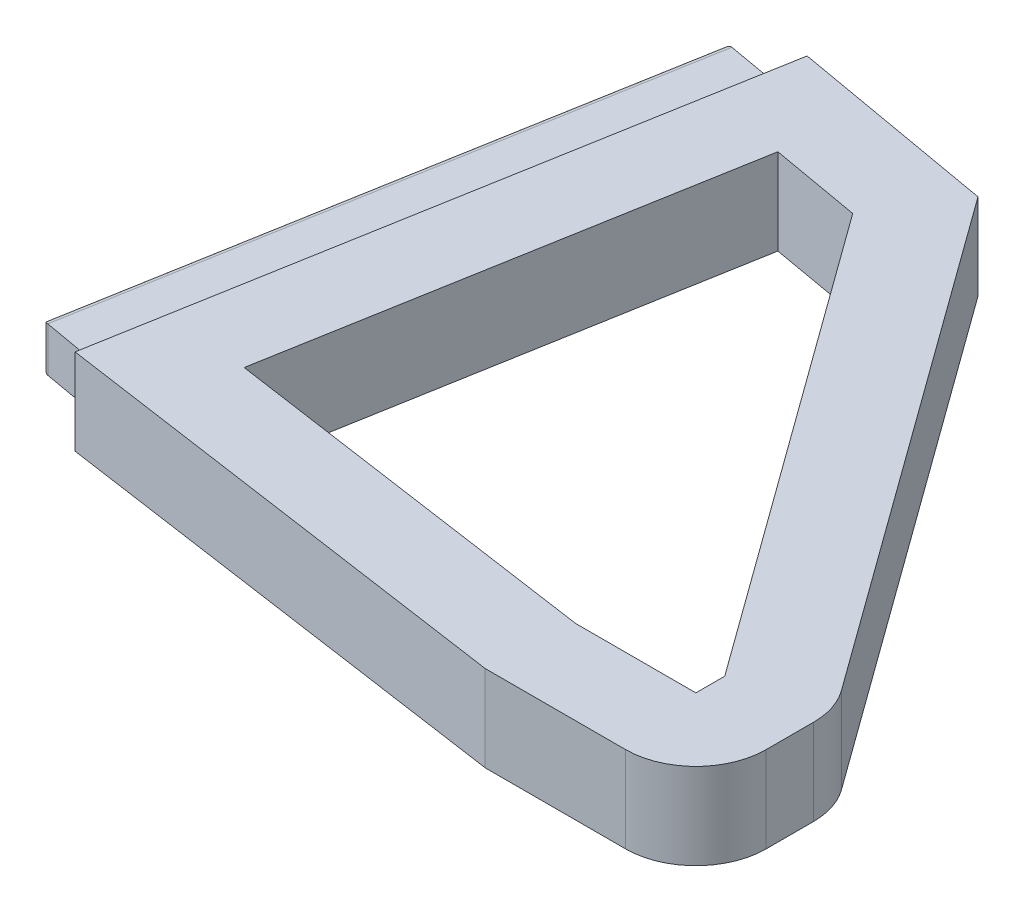
ISO-10303-21;
HEADER;
FILE_DESCRIPTION(('STEP AP214'),'2;1');
FILE_NAME('part.step','',(''),(''),'','','');
FILE_SCHEMA(('AUTOMOTIVE_DESIGN { 1 0 10303 214 1 1 1 1 }'));
ENDSEC;
DATA;
#1=APPLICATION_CONTEXT('core data for automotive mechanical design processes');
#2=APPLICATION_PROTOCOL_DEFINITION('international standard','automotive_design',2000,#1);
#3=PRODUCT_CONTEXT('',#1,'mechanical');
#4=PRODUCT('Part','Part','',(#3));
#5=PRODUCT_RELATED_PRODUCT_CATEGORY('part','',(#4));
#6=PRODUCT_DEFINITION_FORMATION('','',#4);
#7=PRODUCT_DEFINITION_CONTEXT('part definition',#1,'design');
#8=PRODUCT_DEFINITION('design','',#6,#7);
#9=PRODUCT_DEFINITION_SHAPE('','',#8);
#10=(LENGTH_UNIT() NAMED_UNIT(*) SI_UNIT(.MILLI.,.METRE.));
#11=(NAMED_UNIT(*) PLANE_ANGLE_UNIT() SI_UNIT($,.RADIAN.));
#12=(NAMED_UNIT(*) SI_UNIT($,.STERADIAN.) SOLID_ANGLE_UNIT());
#13=UNCERTAINTY_MEASURE_WITH_UNIT(LENGTH_MEASURE(1.E-05),#10,'distance_accuracy_value','');
#14=(GEOMETRIC_REPRESENTATION_CONTEXT(3) GLOBAL_UNCERTAINTY_ASSIGNED_CONTEXT((#13)) GLOBAL_UNIT_ASSIGNED_CONTEXT((#10,
#11,#12)) REPRESENTATION_CONTEXT('',''));
#15=CARTESIAN_POINT('',(0.,0.,0.));
#16=DIRECTION('',(0.,0.,1.));
#17=DIRECTION('',(1.,0.,0.));
#18=AXIS2_PLACEMENT_3D('',#15,#16,#17);
#19=CARTESIAN_POINT('',(17.3648177666923,12.25,-98.4807753012209));
#20=DIRECTION('',(0.984807753012209,0.,0.173648177666923));
#21=DIRECTION('',(0.173648177666923,0.,-0.984807753012209));
#22=AXIS2_PLACEMENT_3D('',#19,#20,#21);
#23=PLANE('',#22);
#24=DIRECTION('',(-0.173648177666923,0.,0.984807753012209));
#25=VECTOR('',#24,1.);
#26=CARTESIAN_POINT('',(17.3648177666923,0.,-98.4807753012209));
#27=LINE('',#26,#25);
#28=CARTESIAN_POINT('',(17.3648177666923,0.,-98.4807753012209));
#29=VERTEX_POINT('',#28);
#30=CARTESIAN_POINT('',(1.73648177666923,0.,-9.84807753012209));
#31=VERTEX_POINT('',#30);
#32=EDGE_CURVE('E313',#29,#31,#27,.T.);
#33=ORIENTED_EDGE('',*,*,#32,.T.);
#34=DIRECTION('',(0.,-1.,0.));
#35=VECTOR('',#34,1.);
#36=CARTESIAN_POINT('',(1.73648177666923,12.25,-9.84807753012209));
#37=LINE('',#36,#35);
#38=CARTESIAN_POINT('',(1.73648177666923,12.25,-9.84807753012209));
#39=VERTEX_POINT('',#38);
#40=EDGE_CURVE('E390',#39,#31,#37,.T.);
#41=ORIENTED_EDGE('',*,*,#40,.F.);
#42=DIRECTION('',(-0.173648177666923,0.,0.984807753012209));
#43=VECTOR('',#42,1.);
#44=CARTESIAN_POINT('',(17.3648177666923,12.25,-98.4807753012209));
#45=LINE('',#44,#43);
#46=CARTESIAN_POINT('',(17.3648177666923,12.25,-98.4807753012209));
#47=VERTEX_POINT('',#46);
#48=EDGE_CURVE('E314',#47,#39,#45,.T.);
#49=ORIENTED_EDGE('',*,*,#48,.F.);
#50=DIRECTION('',(0.,-1.,0.));
#51=VECTOR('',#50,1.);
#52=CARTESIAN_POINT('',(17.3648177666923,12.25,-98.4807753012209));
#53=LINE('',#52,#51);
#54=EDGE_CURVE('E339',#47,#29,#53,.T.);
#55=ORIENTED_EDGE('',*,*,#54,.T.);
#56=EDGE_LOOP('',(#33,#41,#49,#55));
#57=FACE_BOUND('',#56,.T.);
#58=DIRECTION('',(-0.173648177666923,0.,0.984807753012209));
#59=VECTOR('',#58,1.);
#60=CARTESIAN_POINT('',(16.8525556425749,2.95,-95.5755924298349));
#61=LINE('',#60,#59);
#62=CARTESIAN_POINT('',(16.8525556425749,2.95,-95.5755924298349));
#63=VERTEX_POINT('',#62);
#64=CARTESIAN_POINT('',(2.24874390078665,2.95,-12.7532604015081));
#65=VERTEX_POINT('',#64);
#66=EDGE_CURVE('E218',#63,#65,#61,.T.);
#67=ORIENTED_EDGE('',*,*,#66,.F.);
#68=DIRECTION('',(0.,-1.,0.));
#69=VECTOR('',#68,1.);
#70=CARTESIAN_POINT('',(16.8525556425749,9.3,-95.5755924298349));
#71=LINE('',#70,#69);
#72=CARTESIAN_POINT('',(16.8525556425749,9.3,-95.5755924298349));
#73=VERTEX_POINT('',#72);
#74=EDGE_CURVE('E222',#73,#63,#71,.T.);
#75=ORIENTED_EDGE('',*,*,#74,.F.);
#76=DIRECTION('',(0.173648177666923,0.,-0.984807753012209));
#77=VECTOR('',#76,1.);
#78=CARTESIAN_POINT('',(2.24874390078666,9.3,-12.7532604015081));
#79=LINE('',#78,#77);
#80=CARTESIAN_POINT('',(2.24874390078665,9.3,-12.7532604015081));
#81=VERTEX_POINT('',#80);
#82=EDGE_CURVE('E235',#81,#73,#79,.T.);
#83=ORIENTED_EDGE('',*,*,#82,.F.);
#84=DIRECTION('',(0.,1.,0.));
#85=VECTOR('',#84,1.);
#86=CARTESIAN_POINT('',(2.24874390078666,2.95,-12.7532604015081));
#87=LINE('',#86,#85);
#88=EDGE_CURVE('E230',#65,#81,#87,.T.);
#89=ORIENTED_EDGE('',*,*,#88,.F.);
#90=EDGE_LOOP('',(#67,#75,#83,#89));
#91=FACE_BOUND('',#90,.T.);
#92=ADVANCED_FACE('F39',(#57,#91),#23,.F.);
#93=CARTESIAN_POINT('',(90.,12.25,-10.));
#94=DIRECTION('',(0.,-1.,0.));
#95=DIRECTION('',(0.,0.,-1.));
#96=AXIS2_PLACEMENT_3D('',#93,#94,#95);
#97=PLANE('',#96);
#98=ORIENTED_EDGE('',*,*,#48,.T.);
#99=DIRECTION('',(0.989753387242238,0.,0.142787367937493));
#100=VECTOR('',#99,1.);
#101=CARTESIAN_POINT('',(70.,12.25,0.));
#102=LINE('',#101,#100);
#103=CARTESIAN_POINT('',(70.,12.25,0.));
#104=VERTEX_POINT('',#103);
#105=EDGE_CURVE('E317',#39,#104,#102,.T.);
#106=ORIENTED_EDGE('',*,*,#105,.T.);
#107=DIRECTION('',(1.,0.,0.));
#108=VECTOR('',#107,1.);
#109=CARTESIAN_POINT('',(89.9999999999999,12.25,0.));
#110=LINE('',#109,#108);
#111=CARTESIAN_POINT('',(89.9999999999999,12.25,0.));
#112=VERTEX_POINT('',#111);
#113=EDGE_CURVE('E321',#104,#112,#110,.T.);
#114=ORIENTED_EDGE('',*,*,#113,.T.);
#115=CARTESIAN_POINT('',(90.,12.25,-10.));
#116=DIRECTION('',(0.,1.,0.));
#117=DIRECTION('',(0.,0.,-1.));
#118=AXIS2_PLACEMENT_3D('',#115,#116,#117);
#119=CIRCLE('',#118,10.);
#120=CARTESIAN_POINT('',(100.,12.25,-10.0000000000001));
#121=VERTEX_POINT('',#120);
#122=EDGE_CURVE('E324',#112,#121,#119,.T.);
#123=ORIENTED_EDGE('',*,*,#122,.T.);
#124=DIRECTION('',(0.,0.,-1.));
#125=VECTOR('',#124,1.);
#126=CARTESIAN_POINT('',(100.,12.25,-16.7579082127543));
#127=LINE('',#126,#125);
#128=CARTESIAN_POINT('',(100.,12.25,-16.7579082127543));
#129=VERTEX_POINT('',#128);
#130=EDGE_CURVE('E327',#121,#129,#127,.T.);
#131=ORIENTED_EDGE('',*,*,#130,.T.);
#132=CARTESIAN_POINT('',(90.,12.25,-16.7579082127543));
#133=DIRECTION('',(0.,1.,0.));
#134=DIRECTION('',(0.,0.,-1.));
#135=AXIS2_PLACEMENT_3D('',#132,#133,#134);
#136=CIRCLE('',#135,9.99999999999998);
#137=CARTESIAN_POINT('',(98.0977198615752,12.25,-22.6253551058629));
#138=VERTEX_POINT('',#137);
#139=EDGE_CURVE('E330',#129,#138,#136,.T.);
#140=ORIENTED_EDGE('',*,*,#139,.T.);
#141=DIRECTION('',(-0.586744689310867,0.,-0.80977198615752));
#142=VECTOR('',#141,1.);
#143=CARTESIAN_POINT('',(46.9090503570586,12.25,-93.2713299712132));
#144=LINE('',#143,#142);
#145=CARTESIAN_POINT('',(46.9090503570586,12.25,-93.2713299712132));
#146=VERTEX_POINT('',#145);
#147=EDGE_CURVE('E333',#138,#146,#144,.T.);
#148=ORIENTED_EDGE('',*,*,#147,.T.);
#149=DIRECTION('',(-0.984807753012209,0.,-0.173648177666924));
#150=VECTOR('',#149,1.);
#151=CARTESIAN_POINT('',(17.3648177666923,12.25,-98.4807753012209));
#152=LINE('',#151,#150);
#153=EDGE_CURVE('E336',#146,#47,#152,.T.);
#154=ORIENTED_EDGE('',*,*,#153,.T.);
#155=EDGE_LOOP('',(#98,#106,#114,#123,#131,#140,#148,#154));
#156=FACE_BOUND('',#155,.T.);
#157=DIRECTION('',(-0.984807753012209,0.,-0.173648177666924));
#158=VECTOR('',#157,1.);
#159=CARTESIAN_POINT('',(27.0987326708358,12.25,-84.5793041330713));
#160=LINE('',#159,#158);
#161=CARTESIAN_POINT('',(40.0417755377837,12.25,-82.2970964631623));
#162=VERTEX_POINT('',#161);
#163=CARTESIAN_POINT('',(27.0987326708358,12.25,-84.5793041330713));
#164=VERTEX_POINT('',#163);
#165=EDGE_CURVE('E251',#162,#164,#160,.T.);
#166=ORIENTED_EDGE('',*,*,#165,.F.);
#167=DIRECTION('',(-0.586744689310867,0.,-0.80977198615752));
#168=VECTOR('',#167,1.);
#169=CARTESIAN_POINT('',(40.0417755377837,12.25,-82.2970964631623));
#170=LINE('',#169,#168);
#171=CARTESIAN_POINT('',(88.,12.25,-16.1094898553051));
#172=VERTEX_POINT('',#171);
#173=EDGE_CURVE('E268',#172,#162,#170,.T.);
#174=ORIENTED_EDGE('',*,*,#173,.F.);
#175=DIRECTION('',(0.,0.,-1.));
#176=VECTOR('',#175,1.);
#177=CARTESIAN_POINT('',(88.,12.25,-16.1094898553051));
#178=LINE('',#177,#176);
#179=CARTESIAN_POINT('',(88.,12.25,-12.));
#180=VERTEX_POINT('',#179);
#181=EDGE_CURVE('E264',#180,#172,#178,.T.);
#182=ORIENTED_EDGE('',*,*,#181,.F.);
#183=DIRECTION('',(1.,0.,0.));
#184=VECTOR('',#183,1.);
#185=CARTESIAN_POINT('',(88.,12.25,-12.));
#186=LINE('',#185,#184);
#187=CARTESIAN_POINT('',(70.8611360715534,12.25,-12.));
#188=VERTEX_POINT('',#187);
#189=EDGE_CURVE('E261',#188,#180,#186,.T.);
#190=ORIENTED_EDGE('',*,*,#189,.F.);
#191=DIRECTION('',(0.989753387242238,0.,0.142787367937493));
#192=VECTOR('',#191,1.);
#193=CARTESIAN_POINT('',(70.8611360715534,12.25,-12.));
#194=LINE('',#193,#192);
#195=CARTESIAN_POINT('',(15.7041226927374,12.25,-19.9572597226451));
#196=VERTEX_POINT('',#195);
#197=EDGE_CURVE('E258',#196,#188,#194,.T.);
#198=ORIENTED_EDGE('',*,*,#197,.F.);
#199=DIRECTION('',(-0.173648177666923,0.,0.984807753012209));
#200=VECTOR('',#199,1.);
#201=CARTESIAN_POINT('',(27.0987326708358,12.25,-84.5793041330713));
#202=LINE('',#201,#200);
#203=EDGE_CURVE('E254',#164,#196,#202,.T.);
#204=ORIENTED_EDGE('',*,*,#203,.F.);
#205=EDGE_LOOP('',(#166,#174,#182,#190,#198,#204));
#206=FACE_BOUND('',#205,.T.);
#207=ADVANCED_FACE('F457',(#156,#206),#97,.F.);
#208=CARTESIAN_POINT('',(90.,0.,-10.));
#209=DIRECTION('',(0.,-1.,0.));
#210=DIRECTION('',(0.,0.,-1.));
#211=AXIS2_PLACEMENT_3D('',#208,#209,#210);
#212=PLANE('',#211);
#213=ORIENTED_EDGE('',*,*,#32,.F.);
#214=DIRECTION('',(-0.984807753012209,0.,-0.173648177666924));
#215=VECTOR('',#214,1.);
#216=CARTESIAN_POINT('',(17.3648177666923,0.,-98.4807753012209));
#217=LINE('',#216,#215);
#218=CARTESIAN_POINT('',(46.9090503570586,0.,-93.2713299712132));
#219=VERTEX_POINT('',#218);
#220=EDGE_CURVE('E318',#219,#29,#217,.T.);
#221=ORIENTED_EDGE('',*,*,#220,.F.);
#222=DIRECTION('',(-0.586744689310867,0.,-0.80977198615752));
#223=VECTOR('',#222,1.);
#224=CARTESIAN_POINT('',(46.9090503570586,0.,-93.2713299712132));
#225=LINE('',#224,#223);
#226=CARTESIAN_POINT('',(98.0977198615752,0.,-22.6253551058629));
#227=VERTEX_POINT('',#226);
#228=EDGE_CURVE('E358',#227,#219,#225,.T.);
#229=ORIENTED_EDGE('',*,*,#228,.F.);
#230=CARTESIAN_POINT('',(90.,0.,-16.7579082127543));
#231=DIRECTION('',(0.,1.,0.));
#232=DIRECTION('',(0.,0.,-1.));
#233=AXIS2_PLACEMENT_3D('',#230,#231,#232);
#234=CIRCLE('',#233,9.99999999999998);
#235=CARTESIAN_POINT('',(100.,0.,-16.7579082127543));
#236=VERTEX_POINT('',#235);
#237=EDGE_CURVE('E355',#236,#227,#234,.T.);
#238=ORIENTED_EDGE('',*,*,#237,.F.);
#239=DIRECTION('',(0.,0.,-1.));
#240=VECTOR('',#239,1.);
#241=CARTESIAN_POINT('',(100.,0.,-16.7579082127543));
#242=LINE('',#241,#240);
#243=CARTESIAN_POINT('',(100.,0.,-10.0000000000001));
#244=VERTEX_POINT('',#243);
#245=EDGE_CURVE('E352',#244,#236,#242,.T.);
#246=ORIENTED_EDGE('',*,*,#245,.F.);
#247=CARTESIAN_POINT('',(90.,0.,-10.));
#248=DIRECTION('',(0.,1.,0.));
#249=DIRECTION('',(0.,0.,-1.));
#250=AXIS2_PLACEMENT_3D('',#247,#248,#249);
#251=CIRCLE('',#250,10.);
#252=CARTESIAN_POINT('',(89.9999999999999,0.,0.));
#253=VERTEX_POINT('',#252);
#254=EDGE_CURVE('E349',#253,#244,#251,.T.);
#255=ORIENTED_EDGE('',*,*,#254,.F.);
#256=DIRECTION('',(1.,0.,0.));
#257=VECTOR('',#256,1.);
#258=CARTESIAN_POINT('',(89.9999999999999,0.,0.));
#259=LINE('',#258,#257);
#260=CARTESIAN_POINT('',(70.,0.,0.));
#261=VERTEX_POINT('',#260);
#262=EDGE_CURVE('E346',#261,#253,#259,.T.);
#263=ORIENTED_EDGE('',*,*,#262,.F.);
#264=DIRECTION('',(0.989753387242238,0.,0.142787367937493));
#265=VECTOR('',#264,1.);
#266=CARTESIAN_POINT('',(70.,0.,0.));
#267=LINE('',#266,#265);
#268=EDGE_CURVE('E343',#31,#261,#267,.T.);
#269=ORIENTED_EDGE('',*,*,#268,.F.);
#270=EDGE_LOOP('',(#213,#221,#229,#238,#246,#255,#263,#269));
#271=FACE_BOUND('',#270,.T.);
#272=DIRECTION('',(-0.586744689310867,0.,-0.80977198615752));
#273=VECTOR('',#272,1.);
#274=CARTESIAN_POINT('',(40.0417755377837,0.,-82.2970964631623));
#275=LINE('',#274,#273);
#276=CARTESIAN_POINT('',(88.,0.,-16.1094898553051));
#277=VERTEX_POINT('',#276);
#278=CARTESIAN_POINT('',(40.0417755377838,0.,-82.2970964631623));
#279=VERTEX_POINT('',#278);
#280=EDGE_CURVE('E255',#277,#279,#275,.T.);
#281=ORIENTED_EDGE('',*,*,#280,.T.);
#282=DIRECTION('',(-0.984807753012209,0.,-0.173648177666924));
#283=VECTOR('',#282,1.);
#284=CARTESIAN_POINT('',(27.0987326708358,0.,-84.5793041330713));
#285=LINE('',#284,#283);
#286=CARTESIAN_POINT('',(27.0987326708358,0.,-84.5793041330713));
#287=VERTEX_POINT('',#286);
#288=EDGE_CURVE('E250',#279,#287,#285,.T.);
#289=ORIENTED_EDGE('',*,*,#288,.T.);
#290=DIRECTION('',(-0.173648177666923,0.,0.984807753012209));
#291=VECTOR('',#290,1.);
#292=CARTESIAN_POINT('',(27.0987326708358,0.,-84.5793041330713));
#293=LINE('',#292,#291);
#294=CARTESIAN_POINT('',(15.7041226927374,0.,-19.9572597226451));
#295=VERTEX_POINT('',#294);
#296=EDGE_CURVE('E275',#287,#295,#293,.T.);
#297=ORIENTED_EDGE('',*,*,#296,.T.);
#298=DIRECTION('',(0.989753387242238,0.,0.142787367937493));
#299=VECTOR('',#298,1.);
#300=CARTESIAN_POINT('',(70.8611360715534,0.,-12.));
#301=LINE('',#300,#299);
#302=CARTESIAN_POINT('',(70.8611360715534,0.,-12.));
#303=VERTEX_POINT('',#302);
#304=EDGE_CURVE('E279',#295,#303,#301,.T.);
#305=ORIENTED_EDGE('',*,*,#304,.T.);
#306=DIRECTION('',(1.,0.,0.));
#307=VECTOR('',#306,1.);
#308=CARTESIAN_POINT('',(88.,0.,-12.));
#309=LINE('',#308,#307);
#310=CARTESIAN_POINT('',(88.,0.,-12.));
#311=VERTEX_POINT('',#310);
#312=EDGE_CURVE('E283',#303,#311,#309,.T.);
#313=ORIENTED_EDGE('',*,*,#312,.T.);
#314=DIRECTION('',(0.,0.,-1.));
#315=VECTOR('',#314,1.);
#316=CARTESIAN_POINT('',(88.,0.,-16.1094898553051));
#317=LINE('',#316,#315);
#318=EDGE_CURVE('E287',#311,#277,#317,.T.);
#319=ORIENTED_EDGE('',*,*,#318,.T.);
#320=EDGE_LOOP('',(#281,#289,#297,#305,#313,#319));
#321=FACE_BOUND('',#320,.T.);
#322=ADVANCED_FACE('F463',(#271,#321),#212,.T.);
#323=CARTESIAN_POINT('',(70.,12.25,0.));
#324=DIRECTION('',(0.142787367937493,0.,-0.989753387242238));
#325=DIRECTION('',(-0.989753387242238,0.,-0.142787367937493));
#326=AXIS2_PLACEMENT_3D('',#323,#324,#325);
#327=PLANE('',#326);
#328=ORIENTED_EDGE('',*,*,#268,.T.);
#329=DIRECTION('',(0.,-1.,0.));
#330=VECTOR('',#329,1.);
#331=CARTESIAN_POINT('',(70.,12.25,0.));
#332=LINE('',#331,#330);
#333=EDGE_CURVE('E386',#104,#261,#332,.T.);
#334=ORIENTED_EDGE('',*,*,#333,.F.);
#335=ORIENTED_EDGE('',*,*,#105,.F.);
#336=ORIENTED_EDGE('',*,*,#40,.T.);
#337=EDGE_LOOP('',(#328,#334,#335,#336));
#338=FACE_BOUND('',#337,.T.);
#339=ADVANCED_FACE('F468',(#338),#327,.F.);
#340=CARTESIAN_POINT('',(89.9999999999999,12.25,0.));
#341=DIRECTION('',(0.,0.,-1.));
#342=DIRECTION('',(-1.,0.,0.));
#343=AXIS2_PLACEMENT_3D('',#340,#341,#342);
#344=PLANE('',#343);
#345=ORIENTED_EDGE('',*,*,#262,.T.);
#346=DIRECTION('',(0.,-1.,0.));
#347=VECTOR('',#346,1.);
#348=CARTESIAN_POINT('',(89.9999999999999,12.25,0.));
#349=LINE('',#348,#347);
#350=EDGE_CURVE('E382',#112,#253,#349,.T.);
#351=ORIENTED_EDGE('',*,*,#350,.F.);
#352=ORIENTED_EDGE('',*,*,#113,.F.);
#353=ORIENTED_EDGE('',*,*,#333,.T.);
#354=EDGE_LOOP('',(#345,#351,#352,#353));
#355=FACE_BOUND('',#354,.T.);
#356=ADVANCED_FACE('F635',(#355),#344,.F.);
#357=CARTESIAN_POINT('',(90.,12.25,-10.));
#358=DIRECTION('',(0.,-1.,0.));
#359=DIRECTION('',(0.,0.,-1.));
#360=AXIS2_PLACEMENT_3D('',#357,#358,#359);
#361=CYLINDRICAL_SURFACE('',#360,10.);
#362=ORIENTED_EDGE('',*,*,#254,.T.);
#363=DIRECTION('',(0.,-1.,0.));
#364=VECTOR('',#363,1.);
#365=CARTESIAN_POINT('',(100.,12.25,-10.0000000000001));
#366=LINE('',#365,#364);
#367=EDGE_CURVE('E378',#121,#244,#366,.T.);
#368=ORIENTED_EDGE('',*,*,#367,.F.);
#369=ORIENTED_EDGE('',*,*,#122,.F.);
#370=ORIENTED_EDGE('',*,*,#350,.T.);
#371=EDGE_LOOP('',(#362,#368,#369,#370));
#372=FACE_BOUND('',#371,.T.);
#373=ADVANCED_FACE('F626',(#372),#361,.T.);
#374=CARTESIAN_POINT('',(100.,12.25,-16.7579082127543));
#375=DIRECTION('',(-1.,0.,0.));
#376=DIRECTION('',(0.,0.,1.));
#377=AXIS2_PLACEMENT_3D('',#374,#375,#376);
#378=PLANE('',#377);
#379=ORIENTED_EDGE('',*,*,#245,.T.);
#380=DIRECTION('',(0.,-1.,0.));
#381=VECTOR('',#380,1.);
#382=CARTESIAN_POINT('',(100.,12.25,-16.7579082127543));
#383=LINE('',#382,#381);
#384=EDGE_CURVE('E374',#129,#236,#383,.T.);
#385=ORIENTED_EDGE('',*,*,#384,.F.);
#386=ORIENTED_EDGE('',*,*,#130,.F.);
#387=ORIENTED_EDGE('',*,*,#367,.T.);
#388=EDGE_LOOP('',(#379,#385,#386,#387));
#389=FACE_BOUND('',#388,.T.);
#390=ADVANCED_FACE('F617',(#389),#378,.F.);
#391=CARTESIAN_POINT('',(90.,12.25,-16.7579082127543));
#392=DIRECTION('',(0.,-1.,0.));
#393=DIRECTION('',(0.,0.,-1.));
#394=AXIS2_PLACEMENT_3D('',#391,#392,#393);
#395=CYLINDRICAL_SURFACE('',#394,9.99999999999998);
#396=ORIENTED_EDGE('',*,*,#237,.T.);
#397=DIRECTION('',(0.,-1.,0.));
#398=VECTOR('',#397,1.);
#399=CARTESIAN_POINT('',(98.0977198615752,12.25,-22.6253551058629));
#400=LINE('',#399,#398);
#401=EDGE_CURVE('E370',#138,#227,#400,.T.);
#402=ORIENTED_EDGE('',*,*,#401,.F.);
#403=ORIENTED_EDGE('',*,*,#139,.F.);
#404=ORIENTED_EDGE('',*,*,#384,.T.);
#405=EDGE_LOOP('',(#396,#402,#403,#404));
#406=FACE_BOUND('',#405,.T.);
#407=ADVANCED_FACE('F608',(#406),#395,.T.);
#408=CARTESIAN_POINT('',(46.9090503570586,12.25,-93.2713299712132));
#409=DIRECTION('',(-0.80977198615752,0.,0.586744689310867));
#410=DIRECTION('',(0.586744689310867,0.,0.80977198615752));
#411=AXIS2_PLACEMENT_3D('',#408,#409,#410);
#412=PLANE('',#411);
#413=ORIENTED_EDGE('',*,*,#228,.T.);
#414=DIRECTION('',(0.,-1.,0.));
#415=VECTOR('',#414,1.);
#416=CARTESIAN_POINT('',(46.9090503570586,12.25,-93.2713299712132));
#417=LINE('',#416,#415);
#418=EDGE_CURVE('E366',#146,#219,#417,.T.);
#419=ORIENTED_EDGE('',*,*,#418,.F.);
#420=ORIENTED_EDGE('',*,*,#147,.F.);
#421=ORIENTED_EDGE('',*,*,#401,.T.);
#422=EDGE_LOOP('',(#413,#419,#420,#421));
#423=FACE_BOUND('',#422,.T.);
#424=ADVANCED_FACE('F599',(#423),#412,.F.);
#425=CARTESIAN_POINT('',(17.3648177666923,12.25,-98.4807753012209));
#426=DIRECTION('',(-0.173648177666924,0.,0.984807753012209));
#427=DIRECTION('',(0.984807753012209,0.,0.173648177666924));
#428=AXIS2_PLACEMENT_3D('',#425,#426,#427);
#429=PLANE('',#428);
#430=ORIENTED_EDGE('',*,*,#220,.T.);
#431=ORIENTED_EDGE('',*,*,#54,.F.);
#432=ORIENTED_EDGE('',*,*,#153,.F.);
#433=ORIENTED_EDGE('',*,*,#418,.T.);
#434=EDGE_LOOP('',(#430,#431,#432,#433));
#435=FACE_BOUND('',#434,.T.);
#436=ADVANCED_FACE('F590',(#435),#429,.F.);
#437=CARTESIAN_POINT('',(27.0987326708358,12.25,-84.5793041330713));
#438=DIRECTION('',(-0.173648177666924,0.,0.984807753012209));
#439=DIRECTION('',(0.984807753012209,0.,0.173648177666924));
#440=AXIS2_PLACEMENT_3D('',#437,#438,#439);
#441=PLANE('',#440);
#442=ORIENTED_EDGE('',*,*,#288,.F.);
#443=DIRECTION('',(0.,-1.,0.));
#444=VECTOR('',#443,1.);
#445=CARTESIAN_POINT('',(40.0417755377837,12.25,-82.2970964631623));
#446=LINE('',#445,#444);
#447=EDGE_CURVE('E271',#162,#279,#446,.T.);
#448=ORIENTED_EDGE('',*,*,#447,.F.);
#449=ORIENTED_EDGE('',*,*,#165,.T.);
#450=DIRECTION('',(0.,-1.,0.));
#451=VECTOR('',#450,1.);
#452=CARTESIAN_POINT('',(27.0987326708358,12.25,-84.5793041330713));
#453=LINE('',#452,#451);
#454=EDGE_CURVE('E309',#164,#287,#453,.T.);
#455=ORIENTED_EDGE('',*,*,#454,.T.);
#456=EDGE_LOOP('',(#442,#448,#449,#455));
#457=FACE_BOUND('',#456,.T.);
#458=ADVANCED_FACE('F580',(#457),#441,.T.);
#459=CARTESIAN_POINT('',(27.0987326708358,12.25,-84.5793041330713));
#460=DIRECTION('',(0.984807753012209,0.,0.173648177666923));
#461=DIRECTION('',(0.173648177666923,0.,-0.984807753012209));
#462=AXIS2_PLACEMENT_3D('',#459,#460,#461);
#463=PLANE('',#462);
#464=ORIENTED_EDGE('',*,*,#296,.F.);
#465=ORIENTED_EDGE('',*,*,#454,.F.);
#466=ORIENTED_EDGE('',*,*,#203,.T.);
#467=DIRECTION('',(0.,-1.,0.));
#468=VECTOR('',#467,1.);
#469=CARTESIAN_POINT('',(15.7041226927374,12.25,-19.9572597226451));
#470=LINE('',#469,#468);
#471=EDGE_CURVE('E306',#196,#295,#470,.T.);
#472=ORIENTED_EDGE('',*,*,#471,.T.);
#473=EDGE_LOOP('',(#464,#465,#466,#472));
#474=FACE_BOUND('',#473,.T.);
#475=ADVANCED_FACE('F571',(#474),#463,.T.);
#476=CARTESIAN_POINT('',(70.8611360715534,12.25,-12.));
#477=DIRECTION('',(0.142787367937493,0.,-0.989753387242238));
#478=DIRECTION('',(-0.989753387242238,0.,-0.142787367937493));
#479=AXIS2_PLACEMENT_3D('',#476,#477,#478);
#480=PLANE('',#479);
#481=ORIENTED_EDGE('',*,*,#304,.F.);
#482=ORIENTED_EDGE('',*,*,#471,.F.);
#483=ORIENTED_EDGE('',*,*,#197,.T.);
#484=DIRECTION('',(0.,-1.,0.));
#485=VECTOR('',#484,1.);
#486=CARTESIAN_POINT('',(70.8611360715534,12.25,-12.));
#487=LINE('',#486,#485);
#488=EDGE_CURVE('E303',#188,#303,#487,.T.);
#489=ORIENTED_EDGE('',*,*,#488,.T.);
#490=EDGE_LOOP('',(#481,#482,#483,#489));
#491=FACE_BOUND('',#490,.T.);
#492=ADVANCED_FACE('F562',(#491),#480,.T.);
#493=CARTESIAN_POINT('',(88.,12.25,-12.));
#494=DIRECTION('',(0.,0.,-1.));
#495=DIRECTION('',(-1.,0.,0.));
#496=AXIS2_PLACEMENT_3D('',#493,#494,#495);
#497=PLANE('',#496);
#498=ORIENTED_EDGE('',*,*,#312,.F.);
#499=ORIENTED_EDGE('',*,*,#488,.F.);
#500=ORIENTED_EDGE('',*,*,#189,.T.);
#501=DIRECTION('',(0.,-1.,0.));
#502=VECTOR('',#501,1.);
#503=CARTESIAN_POINT('',(88.,12.25,-12.));
#504=LINE('',#503,#502);
#505=EDGE_CURVE('E300',#180,#311,#504,.T.);
#506=ORIENTED_EDGE('',*,*,#505,.T.);
#507=EDGE_LOOP('',(#498,#499,#500,#506));
#508=FACE_BOUND('',#507,.T.);
#509=ADVANCED_FACE('F553',(#508),#497,.T.);
#510=CARTESIAN_POINT('',(88.,12.25,-16.1094898553051));
#511=DIRECTION('',(-1.,0.,0.));
#512=DIRECTION('',(0.,0.,1.));
#513=AXIS2_PLACEMENT_3D('',#510,#511,#512);
#514=PLANE('',#513);
#515=ORIENTED_EDGE('',*,*,#318,.F.);
#516=ORIENTED_EDGE('',*,*,#505,.F.);
#517=ORIENTED_EDGE('',*,*,#181,.T.);
#518=DIRECTION('',(0.,-1.,0.));
#519=VECTOR('',#518,1.);
#520=CARTESIAN_POINT('',(88.,12.25,-16.1094898553051));
#521=LINE('',#520,#519);
#522=EDGE_CURVE('E297',#172,#277,#521,.T.);
#523=ORIENTED_EDGE('',*,*,#522,.T.);
#524=EDGE_LOOP('',(#515,#516,#517,#523));
#525=FACE_BOUND('',#524,.T.);
#526=ADVANCED_FACE('F544',(#525),#514,.T.);
#527=CARTESIAN_POINT('',(40.0417755377837,12.25,-82.2970964631623));
#528=DIRECTION('',(-0.80977198615752,0.,0.586744689310867));
#529=DIRECTION('',(0.586744689310867,0.,0.80977198615752));
#530=AXIS2_PLACEMENT_3D('',#527,#528,#529);
#531=PLANE('',#530);
#532=ORIENTED_EDGE('',*,*,#280,.F.);
#533=ORIENTED_EDGE('',*,*,#522,.F.);
#534=ORIENTED_EDGE('',*,*,#173,.T.);
#535=ORIENTED_EDGE('',*,*,#447,.T.);
#536=EDGE_LOOP('',(#532,#533,#534,#535));
#537=FACE_BOUND('',#536,.T.);
#538=ADVANCED_FACE('F531',(#537),#531,.T.);
#539=CARTESIAN_POINT('',(7.00447811245282,2.95,-97.3120742065041));
#540=DIRECTION('',(0.,1.,0.));
#541=DIRECTION('',(0.,0.,1.));
#542=AXIS2_PLACEMENT_3D('',#539,#540,#541);
#543=PLANE('',#542);
#544=DIRECTION('',(0.984807753012209,0.,0.173648177666923));
#545=VECTOR('',#544,1.);
#546=CARTESIAN_POINT('',(-7.59933362933543,2.95,-14.4897421781773));
#547=LINE('',#546,#545);
#548=CARTESIAN_POINT('',(-6.61452587632323,2.95,-14.3160940005104));
#549=VERTEX_POINT('',#548);
#550=EDGE_CURVE('E247',#549,#65,#547,.T.);
#551=ORIENTED_EDGE('',*,*,#550,.F.);
#552=DIRECTION('',(-0.173648177666923,0.,0.984807753012209));
#553=VECTOR('',#552,1.);
#554=CARTESIAN_POINT('',(7.98928586546502,2.95,-97.1384260288372));
#555=LINE('',#554,#553);
#556=CARTESIAN_POINT('',(7.98928586546502,2.95,-97.1384260288372));
#557=VERTEX_POINT('',#556);
#558=EDGE_CURVE('E70',#549,#557,#555,.F.);
#559=ORIENTED_EDGE('',*,*,#558,.T.);
#560=DIRECTION('',(0.984807753012209,0.,0.173648177666923));
#561=VECTOR('',#560,1.);
#562=CARTESIAN_POINT('',(7.00447811245282,2.95,-97.3120742065041));
#563=LINE('',#562,#561);
#564=EDGE_CURVE('E215',#557,#63,#563,.T.);
#565=ORIENTED_EDGE('',*,*,#564,.T.);
#566=ORIENTED_EDGE('',*,*,#66,.T.);
#567=EDGE_LOOP('',(#551,#559,#565,#566));
#568=FACE_BOUND('',#567,.T.);
#569=ADVANCED_FACE('F217',(#568),#543,.F.);
#570=CARTESIAN_POINT('',(-7.59933362933543,2.95,-14.4897421781773));
#571=DIRECTION('',(0.173648177666923,0.,-0.984807753012209));
#572=DIRECTION('',(-0.984807753012209,0.,-0.173648177666923));
#573=AXIS2_PLACEMENT_3D('',#570,#571,#572);
#574=PLANE('',#573);
#575=DIRECTION('',(0.984807753012209,0.,0.173648177666923));
#576=VECTOR('',#575,1.);
#577=CARTESIAN_POINT('',(-7.59933362933543,9.3,-14.4897421781773));
#578=LINE('',#577,#576);
#579=CARTESIAN_POINT('',(-6.61452587632323,9.3,-14.3160940005104));
#580=VERTEX_POINT('',#579);
#581=EDGE_CURVE('E244',#580,#81,#578,.T.);
#582=ORIENTED_EDGE('',*,*,#581,.F.);
#583=DIRECTION('',(0.,1.,0.));
#584=VECTOR('',#583,1.);
#585=CARTESIAN_POINT('',(-6.61452587632323,2.95,-14.3160940005104));
#586=LINE('',#585,#584);
#587=EDGE_CURVE('E407',#580,#549,#586,.F.);
#588=ORIENTED_EDGE('',*,*,#587,.T.);
#589=ORIENTED_EDGE('',*,*,#550,.T.);
#590=ORIENTED_EDGE('',*,*,#88,.T.);
#591=EDGE_LOOP('',(#582,#588,#589,#590));
#592=FACE_BOUND('',#591,.T.);
#593=ADVANCED_FACE('F443',(#592),#574,.F.);
#594=CARTESIAN_POINT('',(-7.59933362933543,9.3,-14.4897421781773));
#595=DIRECTION('',(0.,-1.,0.));
#596=DIRECTION('',(0.,0.,-1.));
#597=AXIS2_PLACEMENT_3D('',#594,#595,#596);
#598=PLANE('',#597);
#599=DIRECTION('',(0.984807753012209,0.,0.173648177666923));
#600=VECTOR('',#599,1.);
#601=CARTESIAN_POINT('',(7.00447811245282,9.3,-97.3120742065041));
#602=LINE('',#601,#600);
#603=CARTESIAN_POINT('',(7.98928586546502,9.3,-97.1384260288372));
#604=VERTEX_POINT('',#603);
#605=EDGE_CURVE('E221',#604,#73,#602,.T.);
#606=ORIENTED_EDGE('',*,*,#605,.F.);
#607=DIRECTION('',(0.173648177666923,0.,-0.984807753012209));
#608=VECTOR('',#607,1.);
#609=CARTESIAN_POINT('',(-6.61452587632323,9.3,-14.3160940005104));
#610=LINE('',#609,#608);
#611=EDGE_CURVE('E11',#604,#580,#610,.F.);
#612=ORIENTED_EDGE('',*,*,#611,.T.);
#613=ORIENTED_EDGE('',*,*,#581,.T.);
#614=ORIENTED_EDGE('',*,*,#82,.T.);
#615=EDGE_LOOP('',(#606,#612,#613,#614));
#616=FACE_BOUND('',#615,.T.);
#617=ADVANCED_FACE('F440',(#616),#598,.F.);
#618=CARTESIAN_POINT('',(7.00447811245282,9.3,-97.3120742065041));
#619=DIRECTION('',(-0.173648177666923,0.,0.984807753012209));
#620=DIRECTION('',(0.984807753012209,0.,0.173648177666923));
#621=AXIS2_PLACEMENT_3D('',#618,#619,#620);
#622=PLANE('',#621);
#623=ORIENTED_EDGE('',*,*,#564,.F.);
#624=DIRECTION('',(0.,-1.,0.));
#625=VECTOR('',#624,1.);
#626=CARTESIAN_POINT('',(7.98928586546502,9.3,-97.1384260288372));
#627=LINE('',#626,#625);
#628=EDGE_CURVE('E49',#557,#604,#627,.F.);
#629=ORIENTED_EDGE('',*,*,#628,.T.);
#630=ORIENTED_EDGE('',*,*,#605,.T.);
#631=ORIENTED_EDGE('',*,*,#74,.T.);
#632=EDGE_LOOP('',(#623,#629,#630,#631));
#633=FACE_BOUND('',#632,.T.);
#634=ADVANCED_FACE('F233',(#633),#622,.F.);
#635=CARTESIAN_POINT('',(-9.84807753012209,0.,-1.73648177666923));
#636=DIRECTION('',(-0.984807753012209,0.,-0.173648177666923));
#637=DIRECTION('',(-0.173648177666923,0.,0.984807753012209));
#638=AXIS2_PLACEMENT_3D('',#635,#636,#637);
#639=PLANE('',#638);
#640=DIRECTION('',(-0.173648177666923,0.,0.984807753012209));
#641=VECTOR('',#640,1.);
#642=CARTESIAN_POINT('',(-7.59933362933543,3.95,-14.4897421781773));
#643=LINE('',#642,#641);
#644=CARTESIAN_POINT('',(6.83082993478589,3.95,-96.3272664534919));
#645=VERTEX_POINT('',#644);
#646=CARTESIAN_POINT('',(-7.42568545166851,3.95,-15.4745499311896));
#647=VERTEX_POINT('',#646);
#648=EDGE_CURVE('E400',#645,#647,#643,.T.);
#649=ORIENTED_EDGE('',*,*,#648,.T.);
#650=DIRECTION('',(0.,1.,0.));
#651=VECTOR('',#650,1.);
#652=CARTESIAN_POINT('',(-7.42568545166851,9.3,-15.4745499311896));
#653=LINE('',#652,#651);
#654=CARTESIAN_POINT('',(-7.42568545166851,8.3,-15.4745499311896));
#655=VERTEX_POINT('',#654);
#656=EDGE_CURVE('E403',#647,#655,#653,.T.);
#657=ORIENTED_EDGE('',*,*,#656,.T.);
#658=DIRECTION('',(0.173648177666923,0.,-0.984807753012209));
#659=VECTOR('',#658,1.);
#660=CARTESIAN_POINT('',(7.00447811245282,8.3,-97.3120742065041));
#661=LINE('',#660,#659);
#662=CARTESIAN_POINT('',(6.83082993478589,8.3,-96.3272664534919));
#663=VERTEX_POINT('',#662);
#664=EDGE_CURVE('E394',#655,#663,#661,.T.);
#665=ORIENTED_EDGE('',*,*,#664,.T.);
#666=DIRECTION('',(0.,-1.,0.));
#667=VECTOR('',#666,1.);
#668=CARTESIAN_POINT('',(6.83082993478589,2.95,-96.3272664534919));
#669=LINE('',#668,#667);
#670=EDGE_CURVE('E397',#663,#645,#669,.T.);
#671=ORIENTED_EDGE('',*,*,#670,.T.);
#672=EDGE_LOOP('',(#649,#657,#665,#671));
#673=FACE_BOUND('',#672,.T.);
#674=ADVANCED_FACE('F448',(#673),#639,.T.);
#675=CARTESIAN_POINT('',(7.8156376877981,0.,-96.153618275825));
#676=DIRECTION('',(0.,1.,0.));
#677=DIRECTION('',(0.,0.,1.));
#678=AXIS2_PLACEMENT_3D('',#675,#676,#677);
#679=CYLINDRICAL_SURFACE('',#678,1.);
#680=CARTESIAN_POINT('',(7.8156376877981,8.3,-96.153618275825));
#681=DIRECTION('',(-0.122787803968968,0.707106781186547,0.69636424032002));
#682=DIRECTION('',(-0.122787803968968,-0.707106781186547,0.69636424032002));
#683=AXIS2_PLACEMENT_3D('',#680,#681,#682);
#684=ELLIPSE('',#683,1.41421356237309,1.);
#685=EDGE_CURVE('E420',#604,#663,#684,.T.);
#686=ORIENTED_EDGE('',*,*,#685,.F.);
#687=ORIENTED_EDGE('',*,*,#628,.F.);
#688=CARTESIAN_POINT('',(7.8156376877981,3.95,-96.153618275825));
#689=DIRECTION('',(0.122787803968968,0.707106781186547,-0.69636424032002));
#690=DIRECTION('',(-0.122787803968968,0.707106781186547,0.69636424032002));
#691=AXIS2_PLACEMENT_3D('',#688,#689,#690);
#692=ELLIPSE('',#691,1.41421356237309,1.);
#693=EDGE_CURVE('E43',#645,#557,#692,.F.);
#694=ORIENTED_EDGE('',*,*,#693,.F.);
#695=ORIENTED_EDGE('',*,*,#670,.F.);
#696=EDGE_LOOP('',(#686,#687,#694,#695));
#697=FACE_BOUND('',#696,.T.);
#698=ADVANCED_FACE('F41',(#697),#679,.T.);
#699=CARTESIAN_POINT('',(-8.86326977710988,3.95,-1.56283359900231));
#700=DIRECTION('',(0.173648177666923,0.,-0.984807753012209));
#701=DIRECTION('',(-0.984807753012209,0.,-0.173648177666923));
#702=AXIS2_PLACEMENT_3D('',#699,#700,#701);
#703=CYLINDRICAL_SURFACE('',#702,1.);
#704=ORIENTED_EDGE('',*,*,#693,.T.);
#705=ORIENTED_EDGE('',*,*,#558,.F.);
#706=CARTESIAN_POINT('',(-6.4408776986563,3.95,-15.3009017535226));
#707=DIRECTION('',(0.122787803968968,-0.707106781186547,-0.69636424032002));
#708=DIRECTION('',(0.122787803968968,0.707106781186547,-0.69636424032002));
#709=AXIS2_PLACEMENT_3D('',#706,#707,#708);
#710=ELLIPSE('',#709,1.41421356237309,1.);
#711=EDGE_CURVE('E418',#647,#549,#710,.F.);
#712=ORIENTED_EDGE('',*,*,#711,.F.);
#713=ORIENTED_EDGE('',*,*,#648,.F.);
#714=EDGE_LOOP('',(#704,#705,#712,#713));
#715=FACE_BOUND('',#714,.T.);
#716=ADVANCED_FACE('F432',(#715),#703,.T.);
#717=CARTESIAN_POINT('',(-8.86326977710988,8.3,-1.56283359900231));
#718=DIRECTION('',(-0.173648177666923,0.,0.984807753012209));
#719=DIRECTION('',(0.984807753012209,0.,0.173648177666923));
#720=AXIS2_PLACEMENT_3D('',#717,#718,#719);
#721=CYLINDRICAL_SURFACE('',#720,1.);
#722=ORIENTED_EDGE('',*,*,#685,.T.);
#723=ORIENTED_EDGE('',*,*,#664,.F.);
#724=CARTESIAN_POINT('',(-6.4408776986563,8.3,-15.3009017535226));
#725=DIRECTION('',(-0.122787803968968,-0.707106781186547,0.69636424032002));
#726=DIRECTION('',(-0.122787803968968,0.707106781186547,0.69636424032002));
#727=AXIS2_PLACEMENT_3D('',#724,#725,#726);
#728=ELLIPSE('',#727,1.41421356237309,1.);
#729=EDGE_CURVE('E415',#580,#655,#728,.T.);
#730=ORIENTED_EDGE('',*,*,#729,.F.);
#731=ORIENTED_EDGE('',*,*,#611,.F.);
#732=EDGE_LOOP('',(#722,#723,#730,#731));
#733=FACE_BOUND('',#732,.T.);
#734=ADVANCED_FACE('F437',(#733),#721,.T.);
#735=CARTESIAN_POINT('',(-6.4408776986563,0.,-15.3009017535226));
#736=DIRECTION('',(0.,-1.,0.));
#737=DIRECTION('',(0.,0.,-1.));
#738=AXIS2_PLACEMENT_3D('',#735,#736,#737);
#739=CYLINDRICAL_SURFACE('',#738,1.);
#740=ORIENTED_EDGE('',*,*,#711,.T.);
#741=ORIENTED_EDGE('',*,*,#587,.F.);
#742=ORIENTED_EDGE('',*,*,#729,.T.);
#743=ORIENTED_EDGE('',*,*,#656,.F.);
#744=EDGE_LOOP('',(#740,#741,#742,#743));
#745=FACE_BOUND('',#744,.T.);
#746=ADVANCED_FACE('F445',(#745),#739,.T.);
#747=CLOSED_SHELL('',(#92,#207,#322,#339,#356,#373,#390,#407,#424,#436,#458,#475,#492,#509,#526,
#538,#569,#593,#617,#634,#674,#698,#716,#734,#746));
#748=MANIFOLD_SOLID_BREP('B2',#747);
#749=ADVANCED_BREP_SHAPE_REPRESENTATION('',(#18,#748),#14);
#750=SHAPE_DEFINITION_REPRESENTATION(#9,#749);
ENDSEC;
END-ISO-10303-21;
